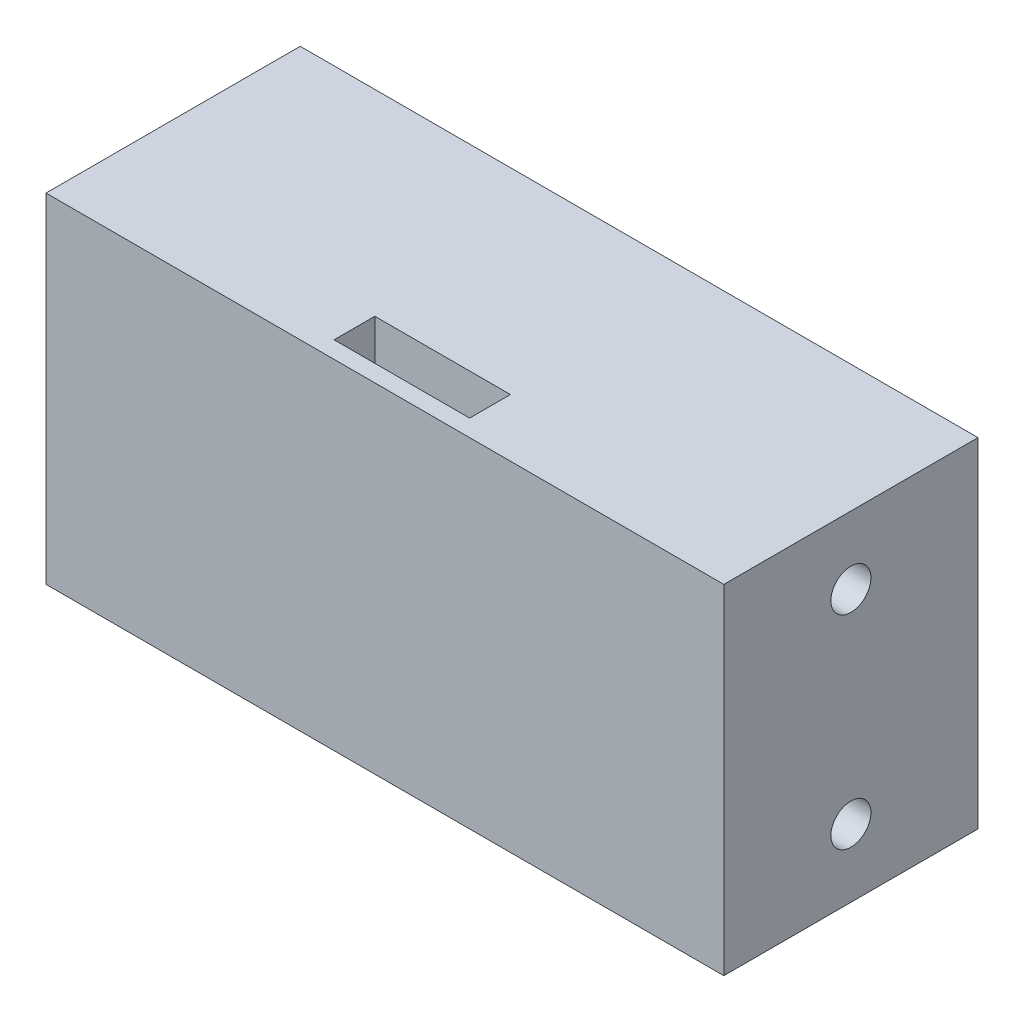
ISO-10303-21;
HEADER;
FILE_DESCRIPTION(('STEP AP214'),'2;1');
FILE_NAME('part.step','',(''),(''),'','','');
FILE_SCHEMA(('AUTOMOTIVE_DESIGN { 1 0 10303 214 1 1 1 1 }'));
ENDSEC;
DATA;
#1=APPLICATION_CONTEXT('core data for automotive mechanical design processes');
#2=APPLICATION_PROTOCOL_DEFINITION('international standard','automotive_design',2000,#1);
#3=PRODUCT_CONTEXT('',#1,'mechanical');
#4=PRODUCT('Part','Part','',(#3));
#5=PRODUCT_RELATED_PRODUCT_CATEGORY('part','',(#4));
#6=PRODUCT_DEFINITION_FORMATION('','',#4);
#7=PRODUCT_DEFINITION_CONTEXT('part definition',#1,'design');
#8=PRODUCT_DEFINITION('design','',#6,#7);
#9=PRODUCT_DEFINITION_SHAPE('','',#8);
#10=(LENGTH_UNIT() NAMED_UNIT(*) SI_UNIT(.MILLI.,.METRE.));
#11=(NAMED_UNIT(*) PLANE_ANGLE_UNIT() SI_UNIT($,.RADIAN.));
#12=(NAMED_UNIT(*) SI_UNIT($,.STERADIAN.) SOLID_ANGLE_UNIT());
#13=UNCERTAINTY_MEASURE_WITH_UNIT(LENGTH_MEASURE(1.E-05),#10,'distance_accuracy_value','');
#14=(GEOMETRIC_REPRESENTATION_CONTEXT(3) GLOBAL_UNCERTAINTY_ASSIGNED_CONTEXT((#13)) GLOBAL_UNIT_ASSIGNED_CONTEXT((#10,
#11,#12)) REPRESENTATION_CONTEXT('',''));
#15=CARTESIAN_POINT('',(0.,0.,0.));
#16=DIRECTION('',(0.,0.,1.));
#17=DIRECTION('',(1.,0.,0.));
#18=AXIS2_PLACEMENT_3D('',#15,#16,#17);
#19=CARTESIAN_POINT('',(-25.4,-12.7,19.05));
#20=DIRECTION('',(1.,0.,0.));
#21=DIRECTION('',(0.,0.,-1.));
#22=AXIS2_PLACEMENT_3D('',#19,#20,#21);
#23=PLANE('',#22);
#24=CARTESIAN_POINT('',(-25.4,-7.62,9.525));
#25=DIRECTION('',(-1.,0.,0.));
#26=DIRECTION('',(0.,0.,1.));
#27=AXIS2_PLACEMENT_3D('',#24,#25,#26);
#28=CIRCLE('',#27,1.5);
#29=CARTESIAN_POINT('',(-25.4,-7.62,11.025));
#30=VERTEX_POINT('',#29);
#31=EDGE_CURVE('E366',#30,#30,#28,.T.);
#32=ORIENTED_EDGE('',*,*,#31,.F.);
#33=EDGE_LOOP('',(#32));
#34=FACE_BOUND('',#33,.T.);
#35=CARTESIAN_POINT('',(-25.4,7.62,9.525));
#36=DIRECTION('',(-1.,0.,0.));
#37=DIRECTION('',(0.,0.,1.));
#38=AXIS2_PLACEMENT_3D('',#35,#36,#37);
#39=CIRCLE('',#38,1.5);
#40=CARTESIAN_POINT('',(-25.4,7.62,11.025));
#41=VERTEX_POINT('',#40);
#42=EDGE_CURVE('E154',#41,#41,#39,.T.);
#43=ORIENTED_EDGE('',*,*,#42,.F.);
#44=EDGE_LOOP('',(#43));
#45=FACE_BOUND('',#44,.T.);
#46=DIRECTION('',(0.,-1.,0.));
#47=VECTOR('',#46,1.);
#48=CARTESIAN_POINT('',(-25.4,-12.7,0.));
#49=LINE('',#48,#47);
#50=CARTESIAN_POINT('',(-25.4,12.7,0.));
#51=VERTEX_POINT('',#50);
#52=CARTESIAN_POINT('',(-25.4,-12.7,0.));
#53=VERTEX_POINT('',#52);
#54=EDGE_CURVE('E186',#51,#53,#49,.T.);
#55=ORIENTED_EDGE('',*,*,#54,.T.);
#56=DIRECTION('',(0.,0.,-1.));
#57=VECTOR('',#56,1.);
#58=CARTESIAN_POINT('',(-25.4,-12.7,19.05));
#59=LINE('',#58,#57);
#60=CARTESIAN_POINT('',(-25.4,-12.7,19.05));
#61=VERTEX_POINT('',#60);
#62=EDGE_CURVE('E11',#61,#53,#59,.T.);
#63=ORIENTED_EDGE('',*,*,#62,.F.);
#64=DIRECTION('',(0.,-1.,0.));
#65=VECTOR('',#64,1.);
#66=CARTESIAN_POINT('',(-25.4,-12.7,19.05));
#67=LINE('',#66,#65);
#68=CARTESIAN_POINT('',(-25.4,12.7,19.05));
#69=VERTEX_POINT('',#68);
#70=EDGE_CURVE('E191',#69,#61,#67,.T.);
#71=ORIENTED_EDGE('',*,*,#70,.F.);
#72=DIRECTION('',(0.,0.,-1.));
#73=VECTOR('',#72,1.);
#74=CARTESIAN_POINT('',(-25.4,12.7,19.05));
#75=LINE('',#74,#73);
#76=EDGE_CURVE('E205',#69,#51,#75,.T.);
#77=ORIENTED_EDGE('',*,*,#76,.T.);
#78=EDGE_LOOP('',(#55,#63,#71,#77));
#79=FACE_BOUND('',#78,.T.);
#80=ADVANCED_FACE('F39',(#34,#45,#79),#23,.F.);
#81=CARTESIAN_POINT('',(25.4,-12.7,19.05));
#82=DIRECTION('',(0.,1.,0.));
#83=DIRECTION('',(-1.,0.,0.));
#84=AXIS2_PLACEMENT_3D('',#81,#82,#83);
#85=PLANE('',#84);
#86=DIRECTION('',(1.,0.,0.));
#87=VECTOR('',#86,1.);
#88=CARTESIAN_POINT('',(25.4,-12.7,0.));
#89=LINE('',#88,#87);
#90=CARTESIAN_POINT('',(25.4,-12.7,0.));
#91=VERTEX_POINT('',#90);
#92=EDGE_CURVE('E209',#53,#91,#89,.T.);
#93=ORIENTED_EDGE('',*,*,#92,.T.);
#94=DIRECTION('',(0.,0.,-1.));
#95=VECTOR('',#94,1.);
#96=CARTESIAN_POINT('',(25.4,-12.7,19.05));
#97=LINE('',#96,#95);
#98=CARTESIAN_POINT('',(25.4,-12.7,19.05));
#99=VERTEX_POINT('',#98);
#100=EDGE_CURVE('E47',#99,#91,#97,.T.);
#101=ORIENTED_EDGE('',*,*,#100,.F.);
#102=DIRECTION('',(1.,0.,0.));
#103=VECTOR('',#102,1.);
#104=CARTESIAN_POINT('',(25.4,-12.7,19.05));
#105=LINE('',#104,#103);
#106=EDGE_CURVE('E195',#61,#99,#105,.T.);
#107=ORIENTED_EDGE('',*,*,#106,.F.);
#108=ORIENTED_EDGE('',*,*,#62,.T.);
#109=EDGE_LOOP('',(#93,#101,#107,#108));
#110=FACE_BOUND('',#109,.T.);
#111=ADVANCED_FACE('F245',(#110),#85,.F.);
#112=CARTESIAN_POINT('',(25.4,-12.7,19.05));
#113=DIRECTION('',(-1.,0.,0.));
#114=DIRECTION('',(0.,0.,1.));
#115=AXIS2_PLACEMENT_3D('',#112,#113,#114);
#116=PLANE('',#115);
#117=CARTESIAN_POINT('',(25.4,7.62,9.525));
#118=DIRECTION('',(1.,0.,0.));
#119=DIRECTION('',(0.,0.,-1.));
#120=AXIS2_PLACEMENT_3D('',#117,#118,#119);
#121=CIRCLE('',#120,1.5);
#122=CARTESIAN_POINT('',(25.4,7.62,8.025));
#123=VERTEX_POINT('',#122);
#124=EDGE_CURVE('E356',#123,#123,#121,.T.);
#125=ORIENTED_EDGE('',*,*,#124,.F.);
#126=EDGE_LOOP('',(#125));
#127=FACE_BOUND('',#126,.T.);
#128=CARTESIAN_POINT('',(25.4,-7.62,9.525));
#129=DIRECTION('',(1.,0.,0.));
#130=DIRECTION('',(0.,0.,-1.));
#131=AXIS2_PLACEMENT_3D('',#128,#129,#130);
#132=CIRCLE('',#131,1.5);
#133=CARTESIAN_POINT('',(25.4,-7.62,8.025));
#134=VERTEX_POINT('',#133);
#135=EDGE_CURVE('E333',#134,#134,#132,.T.);
#136=ORIENTED_EDGE('',*,*,#135,.F.);
#137=EDGE_LOOP('',(#136));
#138=FACE_BOUND('',#137,.T.);
#139=DIRECTION('',(0.,1.,0.));
#140=VECTOR('',#139,1.);
#141=CARTESIAN_POINT('',(25.4,-12.7,0.));
#142=LINE('',#141,#140);
#143=CARTESIAN_POINT('',(25.4,12.7,0.));
#144=VERTEX_POINT('',#143);
#145=EDGE_CURVE('E212',#91,#144,#142,.T.);
#146=ORIENTED_EDGE('',*,*,#145,.T.);
#147=DIRECTION('',(0.,0.,-1.));
#148=VECTOR('',#147,1.);
#149=CARTESIAN_POINT('',(25.4,12.7,19.05));
#150=LINE('',#149,#148);
#151=CARTESIAN_POINT('',(25.4,12.7,19.05));
#152=VERTEX_POINT('',#151);
#153=EDGE_CURVE('E220',#152,#144,#150,.T.);
#154=ORIENTED_EDGE('',*,*,#153,.F.);
#155=DIRECTION('',(0.,1.,0.));
#156=VECTOR('',#155,1.);
#157=CARTESIAN_POINT('',(25.4,-12.7,19.05));
#158=LINE('',#157,#156);
#159=EDGE_CURVE('E199',#99,#152,#158,.T.);
#160=ORIENTED_EDGE('',*,*,#159,.F.);
#161=ORIENTED_EDGE('',*,*,#100,.T.);
#162=EDGE_LOOP('',(#146,#154,#160,#161));
#163=FACE_BOUND('',#162,.T.);
#164=ADVANCED_FACE('F229',(#127,#138,#163),#116,.F.);
#165=CARTESIAN_POINT('',(25.4,12.7,19.05));
#166=DIRECTION('',(0.,-1.,0.));
#167=DIRECTION('',(1.,0.,0.));
#168=AXIS2_PLACEMENT_3D('',#165,#166,#167);
#169=PLANE('',#168);
#170=DIRECTION('',(1.,0.,0.));
#171=VECTOR('',#170,1.);
#172=CARTESIAN_POINT('',(5.08,12.7,17.78));
#173=LINE('',#172,#171);
#174=CARTESIAN_POINT('',(-5.08,12.7,17.78));
#175=VERTEX_POINT('',#174);
#176=CARTESIAN_POINT('',(5.08,12.7,17.78));
#177=VERTEX_POINT('',#176);
#178=EDGE_CURVE('E122',#175,#177,#173,.T.);
#179=ORIENTED_EDGE('',*,*,#178,.F.);
#180=DIRECTION('',(0.,0.,1.));
#181=VECTOR('',#180,1.);
#182=CARTESIAN_POINT('',(-5.08,12.7,14.7254436856343));
#183=LINE('',#182,#181);
#184=CARTESIAN_POINT('',(-5.08,12.7,14.7254436856343));
#185=VERTEX_POINT('',#184);
#186=EDGE_CURVE('E61',#185,#175,#183,.T.);
#187=ORIENTED_EDGE('',*,*,#186,.F.);
#188=DIRECTION('',(-1.,0.,0.));
#189=VECTOR('',#188,1.);
#190=CARTESIAN_POINT('',(5.08,12.7,14.7254436856343));
#191=LINE('',#190,#189);
#192=CARTESIAN_POINT('',(5.08,12.7,14.7254436856343));
#193=VERTEX_POINT('',#192);
#194=EDGE_CURVE('E172',#193,#185,#191,.T.);
#195=ORIENTED_EDGE('',*,*,#194,.F.);
#196=DIRECTION('',(0.,0.,-1.));
#197=VECTOR('',#196,1.);
#198=CARTESIAN_POINT('',(5.08,12.7,14.7254436856343));
#199=LINE('',#198,#197);
#200=EDGE_CURVE('E177',#177,#193,#199,.T.);
#201=ORIENTED_EDGE('',*,*,#200,.F.);
#202=EDGE_LOOP('',(#179,#187,#195,#201));
#203=FACE_BOUND('',#202,.T.);
#204=DIRECTION('',(-1.,0.,0.));
#205=VECTOR('',#204,1.);
#206=CARTESIAN_POINT('',(25.4,12.7,0.));
#207=LINE('',#206,#205);
#208=EDGE_CURVE('E196',#144,#51,#207,.T.);
#209=ORIENTED_EDGE('',*,*,#208,.T.);
#210=ORIENTED_EDGE('',*,*,#76,.F.);
#211=DIRECTION('',(-1.,0.,0.));
#212=VECTOR('',#211,1.);
#213=CARTESIAN_POINT('',(25.4,12.7,19.05));
#214=LINE('',#213,#212);
#215=EDGE_CURVE('E202',#152,#69,#214,.T.);
#216=ORIENTED_EDGE('',*,*,#215,.F.);
#217=ORIENTED_EDGE('',*,*,#153,.T.);
#218=EDGE_LOOP('',(#209,#210,#216,#217));
#219=FACE_BOUND('',#218,.T.);
#220=ADVANCED_FACE('F238',(#203,#219),#169,.F.);
#221=CARTESIAN_POINT('',(0.,0.,19.05));
#222=DIRECTION('',(0.,0.,1.));
#223=DIRECTION('',(1.,0.,0.));
#224=AXIS2_PLACEMENT_3D('',#221,#222,#223);
#225=PLANE('',#224);
#226=ORIENTED_EDGE('',*,*,#70,.T.);
#227=ORIENTED_EDGE('',*,*,#106,.T.);
#228=ORIENTED_EDGE('',*,*,#159,.T.);
#229=ORIENTED_EDGE('',*,*,#215,.T.);
#230=EDGE_LOOP('',(#226,#227,#228,#229));
#231=FACE_BOUND('',#230,.T.);
#232=ADVANCED_FACE('F244',(#231),#225,.T.);
#233=CARTESIAN_POINT('',(0.,0.,0.));
#234=DIRECTION('',(0.,0.,1.));
#235=DIRECTION('',(1.,0.,0.));
#236=AXIS2_PLACEMENT_3D('',#233,#234,#235);
#237=PLANE('',#236);
#238=CARTESIAN_POINT('',(-22.225,0.,0.));
#239=DIRECTION('',(0.,0.,-1.));
#240=DIRECTION('',(-1.,0.,0.));
#241=AXIS2_PLACEMENT_3D('',#238,#239,#240);
#242=CIRCLE('',#241,1.5);
#243=CARTESIAN_POINT('',(-23.725,0.,0.));
#244=VERTEX_POINT('',#243);
#245=EDGE_CURVE('E334',#244,#244,#242,.T.);
#246=ORIENTED_EDGE('',*,*,#245,.F.);
#247=EDGE_LOOP('',(#246));
#248=FACE_BOUND('',#247,.T.);
#249=CARTESIAN_POINT('',(22.225,0.,0.));
#250=DIRECTION('',(0.,0.,-1.));
#251=DIRECTION('',(-1.,0.,0.));
#252=AXIS2_PLACEMENT_3D('',#249,#250,#251);
#253=CIRCLE('',#252,1.5);
#254=CARTESIAN_POINT('',(20.725,0.,0.));
#255=VERTEX_POINT('',#254);
#256=EDGE_CURVE('E348',#255,#255,#253,.T.);
#257=ORIENTED_EDGE('',*,*,#256,.F.);
#258=EDGE_LOOP('',(#257));
#259=FACE_BOUND('',#258,.T.);
#260=DIRECTION('',(1.,0.,0.));
#261=VECTOR('',#260,1.);
#262=CARTESIAN_POINT('',(-5.08000000000001,-6.35,0.));
#263=LINE('',#262,#261);
#264=CARTESIAN_POINT('',(-5.08000000000001,-6.35,0.));
#265=VERTEX_POINT('',#264);
#266=CARTESIAN_POINT('',(5.07999999999999,-6.35,0.));
#267=VERTEX_POINT('',#266);
#268=EDGE_CURVE('E158',#265,#267,#263,.T.);
#269=ORIENTED_EDGE('',*,*,#268,.F.);
#270=DIRECTION('',(0.,1.,0.));
#271=VECTOR('',#270,1.);
#272=CARTESIAN_POINT('',(-5.08000000000001,-6.35,0.));
#273=LINE('',#272,#271);
#274=CARTESIAN_POINT('',(-5.08000000000001,-9.525,0.));
#275=VERTEX_POINT('',#274);
#276=EDGE_CURVE('E54',#275,#265,#273,.T.);
#277=ORIENTED_EDGE('',*,*,#276,.F.);
#278=DIRECTION('',(-1.,0.,0.));
#279=VECTOR('',#278,1.);
#280=CARTESIAN_POINT('',(-5.08000000000001,-9.525,0.));
#281=LINE('',#280,#279);
#282=CARTESIAN_POINT('',(5.07999999999999,-9.525,0.));
#283=VERTEX_POINT('',#282);
#284=EDGE_CURVE('E146',#283,#275,#281,.T.);
#285=ORIENTED_EDGE('',*,*,#284,.F.);
#286=DIRECTION('',(0.,-1.,0.));
#287=VECTOR('',#286,1.);
#288=CARTESIAN_POINT('',(5.07999999999999,-6.35,0.));
#289=LINE('',#288,#287);
#290=EDGE_CURVE('E134',#267,#283,#289,.T.);
#291=ORIENTED_EDGE('',*,*,#290,.F.);
#292=EDGE_LOOP('',(#269,#277,#285,#291));
#293=FACE_BOUND('',#292,.T.);
#294=ORIENTED_EDGE('',*,*,#54,.F.);
#295=ORIENTED_EDGE('',*,*,#208,.F.);
#296=ORIENTED_EDGE('',*,*,#145,.F.);
#297=ORIENTED_EDGE('',*,*,#92,.F.);
#298=EDGE_LOOP('',(#294,#295,#296,#297));
#299=FACE_BOUND('',#298,.T.);
#300=ADVANCED_FACE('F235',(#248,#259,#293,#299),#237,.F.);
#301=CARTESIAN_POINT('',(-5.08,-6.35,14.7254436856343));
#302=DIRECTION('',(-1.,0.,0.));
#303=DIRECTION('',(0.,0.,1.));
#304=AXIS2_PLACEMENT_3D('',#301,#302,#303);
#305=PLANE('',#304);
#306=ORIENTED_EDGE('',*,*,#186,.T.);
#307=DIRECTION('',(0.,1.,0.));
#308=VECTOR('',#307,1.);
#309=CARTESIAN_POINT('',(-5.08,-6.35,17.78));
#310=LINE('',#309,#308);
#311=CARTESIAN_POINT('',(-5.08000000000001,-9.525,17.78));
#312=VERTEX_POINT('',#311);
#313=EDGE_CURVE('E128',#312,#175,#310,.T.);
#314=ORIENTED_EDGE('',*,*,#313,.F.);
#315=DIRECTION('',(0.,0.,-1.));
#316=VECTOR('',#315,1.);
#317=CARTESIAN_POINT('',(-5.08000000000001,-9.525,17.78));
#318=LINE('',#317,#316);
#319=EDGE_CURVE('E139',#312,#275,#318,.T.);
#320=ORIENTED_EDGE('',*,*,#319,.T.);
#321=ORIENTED_EDGE('',*,*,#276,.T.);
#322=DIRECTION('',(0.,0.,-1.));
#323=VECTOR('',#322,1.);
#324=CARTESIAN_POINT('',(-5.08000000000001,-6.35,17.78));
#325=LINE('',#324,#323);
#326=CARTESIAN_POINT('',(-5.08000000000001,-6.35,14.7254436856343));
#327=VERTEX_POINT('',#326);
#328=EDGE_CURVE('E145',#327,#265,#325,.T.);
#329=ORIENTED_EDGE('',*,*,#328,.F.);
#330=DIRECTION('',(0.,1.,0.));
#331=VECTOR('',#330,1.);
#332=CARTESIAN_POINT('',(-5.08,-6.35,14.7254436856343));
#333=LINE('',#332,#331);
#334=EDGE_CURVE('E183',#327,#185,#333,.T.);
#335=ORIENTED_EDGE('',*,*,#334,.T.);
#336=EDGE_LOOP('',(#306,#314,#320,#321,#329,#335));
#337=FACE_BOUND('',#336,.T.);
#338=ADVANCED_FACE('F260',(#337),#305,.F.);
#339=CARTESIAN_POINT('',(5.08,-6.35,14.7254436856343));
#340=DIRECTION('',(0.,0.,-1.));
#341=DIRECTION('',(-1.,0.,0.));
#342=AXIS2_PLACEMENT_3D('',#339,#340,#341);
#343=PLANE('',#342);
#344=ORIENTED_EDGE('',*,*,#194,.T.);
#345=ORIENTED_EDGE('',*,*,#334,.F.);
#346=DIRECTION('',(-1.,0.,0.));
#347=VECTOR('',#346,1.);
#348=CARTESIAN_POINT('',(5.08,-6.35,14.7254436856343));
#349=LINE('',#348,#347);
#350=CARTESIAN_POINT('',(5.08,-6.35,14.7254436856343));
#351=VERTEX_POINT('',#350);
#352=EDGE_CURVE('E169',#351,#327,#349,.T.);
#353=ORIENTED_EDGE('',*,*,#352,.F.);
#354=DIRECTION('',(0.,1.,0.));
#355=VECTOR('',#354,1.);
#356=CARTESIAN_POINT('',(5.08,-6.35,14.7254436856343));
#357=LINE('',#356,#355);
#358=EDGE_CURVE('E127',#351,#193,#357,.T.);
#359=ORIENTED_EDGE('',*,*,#358,.T.);
#360=EDGE_LOOP('',(#344,#345,#353,#359));
#361=FACE_BOUND('',#360,.T.);
#362=ADVANCED_FACE('F266',(#361),#343,.F.);
#363=CARTESIAN_POINT('',(5.08,-6.35,14.7254436856343));
#364=DIRECTION('',(1.,0.,0.));
#365=DIRECTION('',(0.,0.,-1.));
#366=AXIS2_PLACEMENT_3D('',#363,#364,#365);
#367=PLANE('',#366);
#368=ORIENTED_EDGE('',*,*,#200,.T.);
#369=ORIENTED_EDGE('',*,*,#358,.F.);
#370=DIRECTION('',(0.,0.,-1.));
#371=VECTOR('',#370,1.);
#372=CARTESIAN_POINT('',(5.07999999999999,-6.35,17.78));
#373=LINE('',#372,#371);
#374=EDGE_CURVE('E140',#351,#267,#373,.T.);
#375=ORIENTED_EDGE('',*,*,#374,.T.);
#376=ORIENTED_EDGE('',*,*,#290,.T.);
#377=DIRECTION('',(0.,0.,-1.));
#378=VECTOR('',#377,1.);
#379=CARTESIAN_POINT('',(5.07999999999999,-9.525,17.78));
#380=LINE('',#379,#378);
#381=CARTESIAN_POINT('',(5.07999999999999,-9.525,17.78));
#382=VERTEX_POINT('',#381);
#383=EDGE_CURVE('E131',#382,#283,#380,.T.);
#384=ORIENTED_EDGE('',*,*,#383,.F.);
#385=DIRECTION('',(0.,1.,0.));
#386=VECTOR('',#385,1.);
#387=CARTESIAN_POINT('',(5.08,-6.35,17.78));
#388=LINE('',#387,#386);
#389=EDGE_CURVE('E116',#382,#177,#388,.T.);
#390=ORIENTED_EDGE('',*,*,#389,.T.);
#391=EDGE_LOOP('',(#368,#369,#375,#376,#384,#390));
#392=FACE_BOUND('',#391,.T.);
#393=ADVANCED_FACE('F132',(#392),#367,.F.);
#394=CARTESIAN_POINT('',(5.08,-6.35,17.78));
#395=DIRECTION('',(0.,0.,1.));
#396=DIRECTION('',(1.,0.,0.));
#397=AXIS2_PLACEMENT_3D('',#394,#395,#396);
#398=PLANE('',#397);
#399=ORIENTED_EDGE('',*,*,#178,.T.);
#400=ORIENTED_EDGE('',*,*,#389,.F.);
#401=DIRECTION('',(-1.,0.,0.));
#402=VECTOR('',#401,1.);
#403=CARTESIAN_POINT('',(-5.08000000000001,-9.525,17.78));
#404=LINE('',#403,#402);
#405=EDGE_CURVE('E120',#382,#312,#404,.T.);
#406=ORIENTED_EDGE('',*,*,#405,.T.);
#407=ORIENTED_EDGE('',*,*,#313,.T.);
#408=EDGE_LOOP('',(#399,#400,#406,#407));
#409=FACE_BOUND('',#408,.T.);
#410=ADVANCED_FACE('F118',(#409),#398,.F.);
#411=CARTESIAN_POINT('',(-5.08000000000001,-9.525,17.78));
#412=DIRECTION('',(0.,-1.,0.));
#413=DIRECTION('',(1.,0.,0.));
#414=AXIS2_PLACEMENT_3D('',#411,#412,#413);
#415=PLANE('',#414);
#416=ORIENTED_EDGE('',*,*,#284,.T.);
#417=ORIENTED_EDGE('',*,*,#319,.F.);
#418=ORIENTED_EDGE('',*,*,#405,.F.);
#419=ORIENTED_EDGE('',*,*,#383,.T.);
#420=EDGE_LOOP('',(#416,#417,#418,#419));
#421=FACE_BOUND('',#420,.T.);
#422=ADVANCED_FACE('F143',(#421),#415,.F.);
#423=CARTESIAN_POINT('',(-5.08000000000001,-6.35,17.78));
#424=DIRECTION('',(0.,1.,0.));
#425=DIRECTION('',(-1.,0.,0.));
#426=AXIS2_PLACEMENT_3D('',#423,#424,#425);
#427=PLANE('',#426);
#428=ORIENTED_EDGE('',*,*,#352,.T.);
#429=ORIENTED_EDGE('',*,*,#328,.T.);
#430=ORIENTED_EDGE('',*,*,#268,.T.);
#431=ORIENTED_EDGE('',*,*,#374,.F.);
#432=EDGE_LOOP('',(#428,#429,#430,#431));
#433=FACE_BOUND('',#432,.T.);
#434=ADVANCED_FACE('F274',(#433),#427,.F.);
#435=CARTESIAN_POINT('',(-15.24,7.62,9.525));
#436=DIRECTION('',(-1.,0.,0.));
#437=DIRECTION('',(0.,0.,1.));
#438=AXIS2_PLACEMENT_3D('',#435,#436,#437);
#439=CYLINDRICAL_SURFACE('',#438,1.5);
#440=CARTESIAN_POINT('',(-15.24,7.62,9.525));
#441=DIRECTION('',(-1.,0.,0.));
#442=DIRECTION('',(0.,0.,1.));
#443=AXIS2_PLACEMENT_3D('',#440,#441,#442);
#444=CIRCLE('',#443,1.5);
#445=CARTESIAN_POINT('',(-15.24,7.62,11.025));
#446=VERTEX_POINT('',#445);
#447=EDGE_CURVE('E369',#446,#446,#444,.T.);
#448=ORIENTED_EDGE('',*,*,#447,.F.);
#449=EDGE_LOOP('',(#448));
#450=FACE_BOUND('',#449,.T.);
#451=ORIENTED_EDGE('',*,*,#42,.T.);
#452=EDGE_LOOP('',(#451));
#453=FACE_BOUND('',#452,.T.);
#454=ADVANCED_FACE('F277',(#450,#453),#439,.F.);
#455=CARTESIAN_POINT('',(-15.24,7.62,9.525));
#456=DIRECTION('',(-1.,0.,0.));
#457=DIRECTION('',(0.,0.,1.));
#458=AXIS2_PLACEMENT_3D('',#455,#456,#457);
#459=PLANE('',#458);
#460=ORIENTED_EDGE('',*,*,#447,.T.);
#461=EDGE_LOOP('',(#460));
#462=FACE_BOUND('',#461,.T.);
#463=ADVANCED_FACE('F283',(#462),#459,.T.);
#464=CARTESIAN_POINT('',(-15.24,-7.62,9.525));
#465=DIRECTION('',(-1.,0.,0.));
#466=DIRECTION('',(0.,0.,1.));
#467=AXIS2_PLACEMENT_3D('',#464,#465,#466);
#468=CYLINDRICAL_SURFACE('',#467,1.5);
#469=CARTESIAN_POINT('',(-15.24,-7.62,9.525));
#470=DIRECTION('',(-1.,0.,0.));
#471=DIRECTION('',(0.,0.,1.));
#472=AXIS2_PLACEMENT_3D('',#469,#470,#471);
#473=CIRCLE('',#472,1.5);
#474=CARTESIAN_POINT('',(-15.24,-7.62,11.025));
#475=VERTEX_POINT('',#474);
#476=EDGE_CURVE('E159',#475,#475,#473,.T.);
#477=ORIENTED_EDGE('',*,*,#476,.F.);
#478=EDGE_LOOP('',(#477));
#479=FACE_BOUND('',#478,.T.);
#480=ORIENTED_EDGE('',*,*,#31,.T.);
#481=EDGE_LOOP('',(#480));
#482=FACE_BOUND('',#481,.T.);
#483=ADVANCED_FACE('F287',(#479,#482),#468,.F.);
#484=CARTESIAN_POINT('',(-15.24,-7.62,9.525));
#485=DIRECTION('',(-1.,0.,0.));
#486=DIRECTION('',(0.,0.,1.));
#487=AXIS2_PLACEMENT_3D('',#484,#485,#486);
#488=PLANE('',#487);
#489=ORIENTED_EDGE('',*,*,#476,.T.);
#490=EDGE_LOOP('',(#489));
#491=FACE_BOUND('',#490,.T.);
#492=ADVANCED_FACE('F291',(#491),#488,.T.);
#493=CARTESIAN_POINT('',(15.24,-7.62,9.525));
#494=DIRECTION('',(1.,0.,0.));
#495=DIRECTION('',(0.,0.,-1.));
#496=AXIS2_PLACEMENT_3D('',#493,#494,#495);
#497=CYLINDRICAL_SURFACE('',#496,1.5);
#498=CARTESIAN_POINT('',(15.24,-7.62,9.525));
#499=DIRECTION('',(1.,0.,0.));
#500=DIRECTION('',(0.,0.,-1.));
#501=AXIS2_PLACEMENT_3D('',#498,#499,#500);
#502=CIRCLE('',#501,1.5);
#503=CARTESIAN_POINT('',(15.24,-7.62,8.025));
#504=VERTEX_POINT('',#503);
#505=EDGE_CURVE('E339',#504,#504,#502,.T.);
#506=ORIENTED_EDGE('',*,*,#505,.F.);
#507=EDGE_LOOP('',(#506));
#508=FACE_BOUND('',#507,.T.);
#509=ORIENTED_EDGE('',*,*,#135,.T.);
#510=EDGE_LOOP('',(#509));
#511=FACE_BOUND('',#510,.T.);
#512=ADVANCED_FACE('F295',(#508,#511),#497,.F.);
#513=CARTESIAN_POINT('',(15.24,-7.62,9.525));
#514=DIRECTION('',(1.,0.,0.));
#515=DIRECTION('',(0.,0.,-1.));
#516=AXIS2_PLACEMENT_3D('',#513,#514,#515);
#517=PLANE('',#516);
#518=ORIENTED_EDGE('',*,*,#505,.T.);
#519=EDGE_LOOP('',(#518));
#520=FACE_BOUND('',#519,.T.);
#521=ADVANCED_FACE('F299',(#520),#517,.T.);
#522=CARTESIAN_POINT('',(15.24,7.62,9.525));
#523=DIRECTION('',(1.,0.,0.));
#524=DIRECTION('',(0.,0.,-1.));
#525=AXIS2_PLACEMENT_3D('',#522,#523,#524);
#526=CYLINDRICAL_SURFACE('',#525,1.5);
#527=CARTESIAN_POINT('',(15.24,7.62,9.525));
#528=DIRECTION('',(1.,0.,0.));
#529=DIRECTION('',(0.,0.,-1.));
#530=AXIS2_PLACEMENT_3D('',#527,#528,#529);
#531=CIRCLE('',#530,1.5);
#532=CARTESIAN_POINT('',(15.24,7.62,8.025));
#533=VERTEX_POINT('',#532);
#534=EDGE_CURVE('E352',#533,#533,#531,.T.);
#535=ORIENTED_EDGE('',*,*,#534,.F.);
#536=EDGE_LOOP('',(#535));
#537=FACE_BOUND('',#536,.T.);
#538=ORIENTED_EDGE('',*,*,#124,.T.);
#539=EDGE_LOOP('',(#538));
#540=FACE_BOUND('',#539,.T.);
#541=ADVANCED_FACE('F303',(#537,#540),#526,.F.);
#542=CARTESIAN_POINT('',(15.24,7.62,9.525));
#543=DIRECTION('',(1.,0.,0.));
#544=DIRECTION('',(0.,0.,-1.));
#545=AXIS2_PLACEMENT_3D('',#542,#543,#544);
#546=PLANE('',#545);
#547=ORIENTED_EDGE('',*,*,#534,.T.);
#548=EDGE_LOOP('',(#547));
#549=FACE_BOUND('',#548,.T.);
#550=ADVANCED_FACE('F307',(#549),#546,.T.);
#551=CARTESIAN_POINT('',(22.225,0.,10.16));
#552=DIRECTION('',(0.,0.,-1.));
#553=DIRECTION('',(-1.,0.,0.));
#554=AXIS2_PLACEMENT_3D('',#551,#552,#553);
#555=CYLINDRICAL_SURFACE('',#554,1.5);
#556=CARTESIAN_POINT('',(22.225,0.,10.16));
#557=DIRECTION('',(0.,0.,-1.));
#558=DIRECTION('',(-1.,0.,0.));
#559=AXIS2_PLACEMENT_3D('',#556,#557,#558);
#560=CIRCLE('',#559,1.5);
#561=CARTESIAN_POINT('',(20.725,0.,10.16));
#562=VERTEX_POINT('',#561);
#563=EDGE_CURVE('E342',#562,#562,#560,.T.);
#564=ORIENTED_EDGE('',*,*,#563,.F.);
#565=EDGE_LOOP('',(#564));
#566=FACE_BOUND('',#565,.T.);
#567=ORIENTED_EDGE('',*,*,#256,.T.);
#568=EDGE_LOOP('',(#567));
#569=FACE_BOUND('',#568,.T.);
#570=ADVANCED_FACE('F311',(#566,#569),#555,.F.);
#571=CARTESIAN_POINT('',(22.225,0.,10.16));
#572=DIRECTION('',(0.,0.,-1.));
#573=DIRECTION('',(-1.,0.,0.));
#574=AXIS2_PLACEMENT_3D('',#571,#572,#573);
#575=PLANE('',#574);
#576=ORIENTED_EDGE('',*,*,#563,.T.);
#577=EDGE_LOOP('',(#576));
#578=FACE_BOUND('',#577,.T.);
#579=ADVANCED_FACE('F315',(#578),#575,.T.);
#580=CARTESIAN_POINT('',(-22.225,0.,10.16));
#581=DIRECTION('',(0.,0.,-1.));
#582=DIRECTION('',(-1.,0.,0.));
#583=AXIS2_PLACEMENT_3D('',#580,#581,#582);
#584=CYLINDRICAL_SURFACE('',#583,1.5);
#585=CARTESIAN_POINT('',(-22.225,0.,10.16));
#586=DIRECTION('',(0.,0.,-1.));
#587=DIRECTION('',(-1.,0.,0.));
#588=AXIS2_PLACEMENT_3D('',#585,#586,#587);
#589=CIRCLE('',#588,1.5);
#590=CARTESIAN_POINT('',(-23.725,0.,10.16));
#591=VERTEX_POINT('',#590);
#592=EDGE_CURVE('E331',#591,#591,#589,.T.);
#593=ORIENTED_EDGE('',*,*,#592,.F.);
#594=EDGE_LOOP('',(#593));
#595=FACE_BOUND('',#594,.T.);
#596=ORIENTED_EDGE('',*,*,#245,.T.);
#597=EDGE_LOOP('',(#596));
#598=FACE_BOUND('',#597,.T.);
#599=ADVANCED_FACE('F319',(#595,#598),#584,.F.);
#600=CARTESIAN_POINT('',(-22.225,0.,10.16));
#601=DIRECTION('',(0.,0.,-1.));
#602=DIRECTION('',(-1.,0.,0.));
#603=AXIS2_PLACEMENT_3D('',#600,#601,#602);
#604=PLANE('',#603);
#605=ORIENTED_EDGE('',*,*,#592,.T.);
#606=EDGE_LOOP('',(#605));
#607=FACE_BOUND('',#606,.T.);
#608=ADVANCED_FACE('F323',(#607),#604,.T.);
#609=CLOSED_SHELL('',(#80,#111,#164,#220,#232,#300,#338,#362,#393,#410,#422,#434,#454,#463,#483,
#492,#512,#521,#541,#550,#570,#579,#599,#608));
#610=MANIFOLD_SOLID_BREP('B2',#609);
#611=ADVANCED_BREP_SHAPE_REPRESENTATION('',(#18,#610),#14);
#612=SHAPE_DEFINITION_REPRESENTATION(#9,#611);
ENDSEC;
END-ISO-10303-21;
